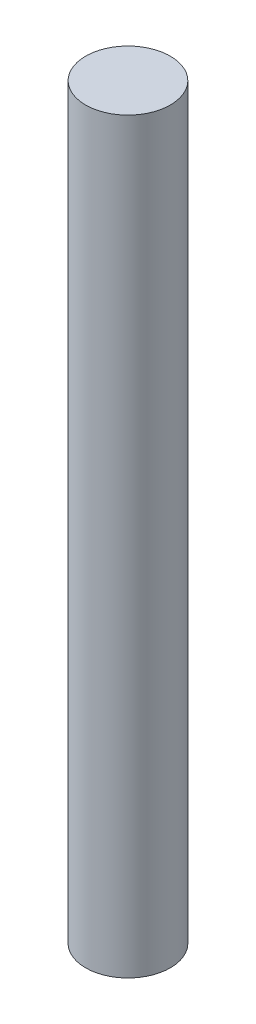
ISO-10303-21;
HEADER;
FILE_DESCRIPTION(('STEP AP214'),'2;1');
FILE_NAME('part.step','',(''),(''),'','','');
FILE_SCHEMA(('AUTOMOTIVE_DESIGN { 1 0 10303 214 1 1 1 1 }'));
ENDSEC;
DATA;
#1=APPLICATION_CONTEXT('core data for automotive mechanical design processes');
#2=APPLICATION_PROTOCOL_DEFINITION('international standard','automotive_design',2000,#1);
#3=PRODUCT_CONTEXT('',#1,'mechanical');
#4=PRODUCT('Part','Part','',(#3));
#5=PRODUCT_RELATED_PRODUCT_CATEGORY('part','',(#4));
#6=PRODUCT_DEFINITION_FORMATION('','',#4);
#7=PRODUCT_DEFINITION_CONTEXT('part definition',#1,'design');
#8=PRODUCT_DEFINITION('design','',#6,#7);
#9=PRODUCT_DEFINITION_SHAPE('','',#8);
#10=(LENGTH_UNIT() NAMED_UNIT(*) SI_UNIT(.MILLI.,.METRE.));
#11=(NAMED_UNIT(*) PLANE_ANGLE_UNIT() SI_UNIT($,.RADIAN.));
#12=(NAMED_UNIT(*) SI_UNIT($,.STERADIAN.) SOLID_ANGLE_UNIT());
#13=UNCERTAINTY_MEASURE_WITH_UNIT(LENGTH_MEASURE(1.E-05),#10,'distance_accuracy_value','');
#14=(GEOMETRIC_REPRESENTATION_CONTEXT(3) GLOBAL_UNCERTAINTY_ASSIGNED_CONTEXT((#13)) GLOBAL_UNIT_ASSIGNED_CONTEXT((#10,
#11,#12)) REPRESENTATION_CONTEXT('',''));
#15=CARTESIAN_POINT('',(0.,0.,0.));
#16=DIRECTION('',(0.,0.,1.));
#17=DIRECTION('',(1.,0.,0.));
#18=AXIS2_PLACEMENT_3D('',#15,#16,#17);
#19=CARTESIAN_POINT('',(-1.62478078476624,30.,-18.0734301425787));
#20=DIRECTION('',(0.,-1.,0.));
#21=DIRECTION('',(0.,0.,-1.));
#22=AXIS2_PLACEMENT_3D('',#19,#20,#21);
#23=CYLINDRICAL_SURFACE('',#22,1.7);
#24=CARTESIAN_POINT('',(-1.62478078476624,30.,-18.0734301425787));
#25=DIRECTION('',(0.,1.,0.));
#26=DIRECTION('',(0.,0.,1.));
#27=AXIS2_PLACEMENT_3D('',#24,#25,#26);
#28=CIRCLE('',#27,1.7);
#29=CARTESIAN_POINT('',(-1.62478078476624,30.,-16.3734301425787));
#30=VERTEX_POINT('',#29);
#31=EDGE_CURVE('E10',#30,#30,#28,.T.);
#32=ORIENTED_EDGE('',*,*,#31,.F.);
#33=EDGE_LOOP('',(#32));
#34=FACE_BOUND('',#33,.T.);
#35=CARTESIAN_POINT('',(-1.62478078476624,0.,-18.0734301425787));
#36=DIRECTION('',(0.,1.,0.));
#37=DIRECTION('',(0.,0.,1.));
#38=AXIS2_PLACEMENT_3D('',#35,#36,#37);
#39=CIRCLE('',#38,1.7);
#40=CARTESIAN_POINT('',(-1.62478078476624,0.,-16.3734301425787));
#41=VERTEX_POINT('',#40);
#42=EDGE_CURVE('E36',#41,#41,#39,.T.);
#43=ORIENTED_EDGE('',*,*,#42,.T.);
#44=EDGE_LOOP('',(#43));
#45=FACE_BOUND('',#44,.T.);
#46=ADVANCED_FACE('F33',(#34,#45),#23,.T.);
#47=CARTESIAN_POINT('',(-1.62478078476624,30.,-18.0734301425787));
#48=DIRECTION('',(0.,1.,0.));
#49=DIRECTION('',(0.,0.,1.));
#50=AXIS2_PLACEMENT_3D('',#47,#48,#49);
#51=PLANE('',#50);
#52=ORIENTED_EDGE('',*,*,#31,.T.);
#53=EDGE_LOOP('',(#52));
#54=FACE_BOUND('',#53,.T.);
#55=ADVANCED_FACE('F48',(#54),#51,.T.);
#56=CARTESIAN_POINT('',(-1.62478078476624,0.,-18.0734301425787));
#57=DIRECTION('',(0.,1.,0.));
#58=DIRECTION('',(0.,0.,1.));
#59=AXIS2_PLACEMENT_3D('',#56,#57,#58);
#60=PLANE('',#59);
#61=ORIENTED_EDGE('',*,*,#42,.F.);
#62=EDGE_LOOP('',(#61));
#63=FACE_BOUND('',#62,.T.);
#64=ADVANCED_FACE('F46',(#63),#60,.F.);
#65=CLOSED_SHELL('',(#46,#55,#64));
#66=MANIFOLD_SOLID_BREP('B2',#65);
#67=ADVANCED_BREP_SHAPE_REPRESENTATION('',(#18,#66),#14);
#68=SHAPE_DEFINITION_REPRESENTATION(#9,#67);
ENDSEC;
END-ISO-10303-21;
